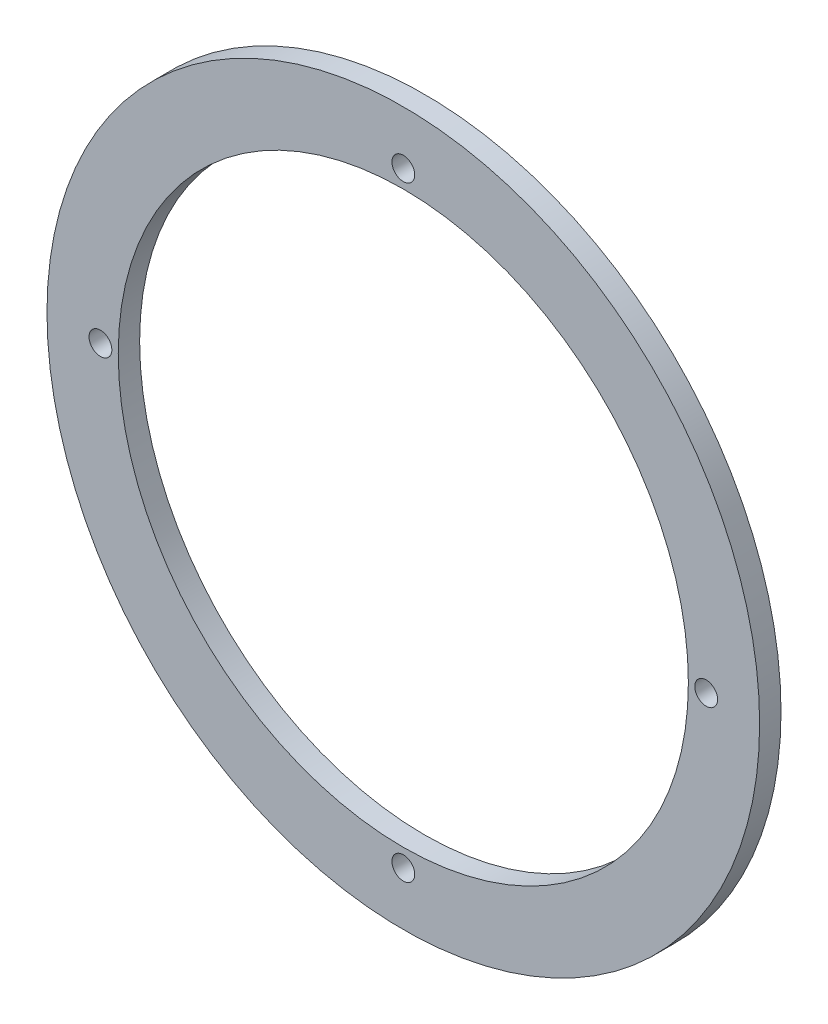
ISO-10303-21;
HEADER;
FILE_DESCRIPTION(('STEP AP214'),'2;1');
FILE_NAME('part.step','',(''),(''),'','','');
FILE_SCHEMA(('AUTOMOTIVE_DESIGN { 1 0 10303 214 1 1 1 1 }'));
ENDSEC;
DATA;
#1=APPLICATION_CONTEXT('core data for automotive mechanical design processes');
#2=APPLICATION_PROTOCOL_DEFINITION('international standard','automotive_design',2000,#1);
#3=PRODUCT_CONTEXT('',#1,'mechanical');
#4=PRODUCT('Part','Part','',(#3));
#5=PRODUCT_RELATED_PRODUCT_CATEGORY('part','',(#4));
#6=PRODUCT_DEFINITION_FORMATION('','',#4);
#7=PRODUCT_DEFINITION_CONTEXT('part definition',#1,'design');
#8=PRODUCT_DEFINITION('design','',#6,#7);
#9=PRODUCT_DEFINITION_SHAPE('','',#8);
#10=(LENGTH_UNIT() NAMED_UNIT(*) SI_UNIT(.MILLI.,.METRE.));
#11=(NAMED_UNIT(*) PLANE_ANGLE_UNIT() SI_UNIT($,.RADIAN.));
#12=(NAMED_UNIT(*) SI_UNIT($,.STERADIAN.) SOLID_ANGLE_UNIT());
#13=UNCERTAINTY_MEASURE_WITH_UNIT(LENGTH_MEASURE(1.E-05),#10,'distance_accuracy_value','');
#14=(GEOMETRIC_REPRESENTATION_CONTEXT(3) GLOBAL_UNCERTAINTY_ASSIGNED_CONTEXT((#13)) GLOBAL_UNIT_ASSIGNED_CONTEXT((#10,
#11,#12)) REPRESENTATION_CONTEXT('',''));
#15=CARTESIAN_POINT('',(0.,0.,0.));
#16=DIRECTION('',(0.,0.,1.));
#17=DIRECTION('',(1.,0.,0.));
#18=AXIS2_PLACEMENT_3D('',#15,#16,#17);
#19=CARTESIAN_POINT('',(0.,0.,3.));
#20=DIRECTION('',(0.,0.,1.));
#21=DIRECTION('',(1.,0.,0.));
#22=AXIS2_PLACEMENT_3D('',#19,#20,#21);
#23=PLANE('',#22);
#24=CARTESIAN_POINT('',(2.40023105489521E-12,-42.5,3.));
#25=DIRECTION('',(0.,0.,1.));
#26=DIRECTION('',(1.,0.,0.));
#27=AXIS2_PLACEMENT_3D('',#24,#25,#26);
#28=CIRCLE('',#27,1.60000000000258);
#29=CARTESIAN_POINT('',(1.60000000000498,-42.5,3.));
#30=VERTEX_POINT('',#29);
#31=EDGE_CURVE('E72',#30,#30,#28,.T.);
#32=ORIENTED_EDGE('',*,*,#31,.F.);
#33=EDGE_LOOP('',(#32));
#34=FACE_BOUND('',#33,.T.);
#35=CARTESIAN_POINT('',(0.,42.5,3.));
#36=DIRECTION('',(0.,0.,1.));
#37=DIRECTION('',(1.,0.,0.));
#38=AXIS2_PLACEMENT_3D('',#35,#36,#37);
#39=CIRCLE('',#38,1.6);
#40=CARTESIAN_POINT('',(1.6,42.5,3.));
#41=VERTEX_POINT('',#40);
#42=EDGE_CURVE('E56',#41,#41,#39,.T.);
#43=ORIENTED_EDGE('',*,*,#42,.F.);
#44=EDGE_LOOP('',(#43));
#45=FACE_BOUND('',#44,.T.);
#46=CARTESIAN_POINT('',(0.,0.,3.));
#47=DIRECTION('',(0.,0.,1.));
#48=DIRECTION('',(1.,0.,0.));
#49=AXIS2_PLACEMENT_3D('',#46,#47,#48);
#50=CIRCLE('',#49,50.);
#51=CARTESIAN_POINT('',(50.,0.,3.));
#52=VERTEX_POINT('',#51);
#53=EDGE_CURVE('E10',#52,#52,#50,.T.);
#54=ORIENTED_EDGE('',*,*,#53,.T.);
#55=EDGE_LOOP('',(#54));
#56=FACE_BOUND('',#55,.T.);
#57=CARTESIAN_POINT('',(0.,0.,3.));
#58=DIRECTION('',(0.,0.,1.));
#59=DIRECTION('',(1.,0.,0.));
#60=AXIS2_PLACEMENT_3D('',#57,#58,#59);
#61=CIRCLE('',#60,40.);
#62=CARTESIAN_POINT('',(40.,0.,3.));
#63=VERTEX_POINT('',#62);
#64=EDGE_CURVE('E50',#63,#63,#61,.T.);
#65=ORIENTED_EDGE('',*,*,#64,.F.);
#66=EDGE_LOOP('',(#65));
#67=FACE_BOUND('',#66,.T.);
#68=CARTESIAN_POINT('',(42.5000000000012,1.20011552744761E-12,3.));
#69=DIRECTION('',(0.,0.,1.));
#70=DIRECTION('',(1.,0.,0.));
#71=AXIS2_PLACEMENT_3D('',#68,#69,#70);
#72=CIRCLE('',#71,1.60000000000094);
#73=CARTESIAN_POINT('',(44.1000000000021,1.20011552744761E-12,3.));
#74=VERTEX_POINT('',#73);
#75=EDGE_CURVE('E64',#74,#74,#72,.T.);
#76=ORIENTED_EDGE('',*,*,#75,.F.);
#77=EDGE_LOOP('',(#76));
#78=FACE_BOUND('',#77,.T.);
#79=CARTESIAN_POINT('',(-42.4999999999988,-1.20532027634398E-12,3.));
#80=DIRECTION('',(0.,0.,1.));
#81=DIRECTION('',(1.,0.,0.));
#82=AXIS2_PLACEMENT_3D('',#79,#80,#81);
#83=CIRCLE('',#82,1.60000000000193);
#84=CARTESIAN_POINT('',(-40.8999999999969,-1.20532027634398E-12,3.));
#85=VERTEX_POINT('',#84);
#86=EDGE_CURVE('E80',#85,#85,#83,.T.);
#87=ORIENTED_EDGE('',*,*,#86,.F.);
#88=EDGE_LOOP('',(#87));
#89=FACE_BOUND('',#88,.T.);
#90=ADVANCED_FACE('F37',(#34,#45,#56,#67,#78,#89),#23,.T.);
#91=CARTESIAN_POINT('',(0.,0.,0.));
#92=DIRECTION('',(0.,0.,1.));
#93=DIRECTION('',(1.,0.,0.));
#94=AXIS2_PLACEMENT_3D('',#91,#92,#93);
#95=PLANE('',#94);
#96=CARTESIAN_POINT('',(0.,0.,0.));
#97=DIRECTION('',(0.,0.,1.));
#98=DIRECTION('',(1.,0.,0.));
#99=AXIS2_PLACEMENT_3D('',#96,#97,#98);
#100=CIRCLE('',#99,50.);
#101=CARTESIAN_POINT('',(50.,0.,0.));
#102=VERTEX_POINT('',#101);
#103=EDGE_CURVE('E41',#102,#102,#100,.T.);
#104=ORIENTED_EDGE('',*,*,#103,.F.);
#105=EDGE_LOOP('',(#104));
#106=FACE_BOUND('',#105,.T.);
#107=CARTESIAN_POINT('',(0.,0.,0.));
#108=DIRECTION('',(0.,0.,1.));
#109=DIRECTION('',(1.,0.,0.));
#110=AXIS2_PLACEMENT_3D('',#107,#108,#109);
#111=CIRCLE('',#110,40.);
#112=CARTESIAN_POINT('',(40.,0.,0.));
#113=VERTEX_POINT('',#112);
#114=EDGE_CURVE('E52',#113,#113,#111,.T.);
#115=ORIENTED_EDGE('',*,*,#114,.T.);
#116=EDGE_LOOP('',(#115));
#117=FACE_BOUND('',#116,.T.);
#118=CARTESIAN_POINT('',(0.,42.5,0.));
#119=DIRECTION('',(0.,0.,1.));
#120=DIRECTION('',(1.,0.,0.));
#121=AXIS2_PLACEMENT_3D('',#118,#119,#120);
#122=CIRCLE('',#121,1.6);
#123=CARTESIAN_POINT('',(1.6,42.5,0.));
#124=VERTEX_POINT('',#123);
#125=EDGE_CURVE('E60',#124,#124,#122,.T.);
#126=ORIENTED_EDGE('',*,*,#125,.T.);
#127=EDGE_LOOP('',(#126));
#128=FACE_BOUND('',#127,.T.);
#129=CARTESIAN_POINT('',(42.5000000000012,1.20011552744761E-12,0.));
#130=DIRECTION('',(0.,0.,1.));
#131=DIRECTION('',(1.,0.,0.));
#132=AXIS2_PLACEMENT_3D('',#129,#130,#131);
#133=CIRCLE('',#132,1.60000000000094);
#134=CARTESIAN_POINT('',(44.1000000000021,1.20011552744761E-12,0.));
#135=VERTEX_POINT('',#134);
#136=EDGE_CURVE('E68',#135,#135,#133,.T.);
#137=ORIENTED_EDGE('',*,*,#136,.T.);
#138=EDGE_LOOP('',(#137));
#139=FACE_BOUND('',#138,.T.);
#140=CARTESIAN_POINT('',(2.40023105489521E-12,-42.5,0.));
#141=DIRECTION('',(0.,0.,1.));
#142=DIRECTION('',(1.,0.,0.));
#143=AXIS2_PLACEMENT_3D('',#140,#141,#142);
#144=CIRCLE('',#143,1.60000000000258);
#145=CARTESIAN_POINT('',(1.60000000000498,-42.5,0.));
#146=VERTEX_POINT('',#145);
#147=EDGE_CURVE('E76',#146,#146,#144,.T.);
#148=ORIENTED_EDGE('',*,*,#147,.T.);
#149=EDGE_LOOP('',(#148));
#150=FACE_BOUND('',#149,.T.);
#151=CARTESIAN_POINT('',(-42.4999999999988,-1.20532027634398E-12,0.));
#152=DIRECTION('',(0.,0.,1.));
#153=DIRECTION('',(1.,0.,0.));
#154=AXIS2_PLACEMENT_3D('',#151,#152,#153);
#155=CIRCLE('',#154,1.60000000000193);
#156=CARTESIAN_POINT('',(-40.8999999999969,-1.20532027634398E-12,0.));
#157=VERTEX_POINT('',#156);
#158=EDGE_CURVE('E84',#157,#157,#155,.T.);
#159=ORIENTED_EDGE('',*,*,#158,.T.);
#160=EDGE_LOOP('',(#159));
#161=FACE_BOUND('',#160,.T.);
#162=ADVANCED_FACE('F96',(#106,#117,#128,#139,#150,#161),#95,.F.);
#163=CARTESIAN_POINT('',(0.,0.,3.));
#164=DIRECTION('',(0.,0.,-1.));
#165=DIRECTION('',(-1.,0.,0.));
#166=AXIS2_PLACEMENT_3D('',#163,#164,#165);
#167=CYLINDRICAL_SURFACE('',#166,50.);
#168=ORIENTED_EDGE('',*,*,#53,.F.);
#169=EDGE_LOOP('',(#168));
#170=FACE_BOUND('',#169,.T.);
#171=ORIENTED_EDGE('',*,*,#103,.T.);
#172=EDGE_LOOP('',(#171));
#173=FACE_BOUND('',#172,.T.);
#174=ADVANCED_FACE('F39',(#170,#173),#167,.T.);
#175=CARTESIAN_POINT('',(0.,0.,3.));
#176=DIRECTION('',(0.,0.,-1.));
#177=DIRECTION('',(-1.,0.,0.));
#178=AXIS2_PLACEMENT_3D('',#175,#176,#177);
#179=CYLINDRICAL_SURFACE('',#178,40.);
#180=ORIENTED_EDGE('',*,*,#64,.T.);
#181=EDGE_LOOP('',(#180));
#182=FACE_BOUND('',#181,.T.);
#183=ORIENTED_EDGE('',*,*,#114,.F.);
#184=EDGE_LOOP('',(#183));
#185=FACE_BOUND('',#184,.T.);
#186=ADVANCED_FACE('F106',(#182,#185),#179,.F.);
#187=CARTESIAN_POINT('',(0.,42.5,3.));
#188=DIRECTION('',(0.,0.,-1.));
#189=DIRECTION('',(-1.,0.,0.));
#190=AXIS2_PLACEMENT_3D('',#187,#188,#189);
#191=CYLINDRICAL_SURFACE('',#190,1.6);
#192=ORIENTED_EDGE('',*,*,#42,.T.);
#193=EDGE_LOOP('',(#192));
#194=FACE_BOUND('',#193,.T.);
#195=ORIENTED_EDGE('',*,*,#125,.F.);
#196=EDGE_LOOP('',(#195));
#197=FACE_BOUND('',#196,.T.);
#198=ADVANCED_FACE('F109',(#194,#197),#191,.F.);
#199=CARTESIAN_POINT('',(42.5000000000012,1.20011552744761E-12,3.));
#200=DIRECTION('',(0.,0.,-1.));
#201=DIRECTION('',(-1.,0.,0.));
#202=AXIS2_PLACEMENT_3D('',#199,#200,#201);
#203=CYLINDRICAL_SURFACE('',#202,1.60000000000094);
#204=ORIENTED_EDGE('',*,*,#75,.T.);
#205=EDGE_LOOP('',(#204));
#206=FACE_BOUND('',#205,.T.);
#207=ORIENTED_EDGE('',*,*,#136,.F.);
#208=EDGE_LOOP('',(#207));
#209=FACE_BOUND('',#208,.T.);
#210=ADVANCED_FACE('F113',(#206,#209),#203,.F.);
#211=CARTESIAN_POINT('',(2.40023105489521E-12,-42.5,3.));
#212=DIRECTION('',(0.,0.,-1.));
#213=DIRECTION('',(-1.,0.,0.));
#214=AXIS2_PLACEMENT_3D('',#211,#212,#213);
#215=CYLINDRICAL_SURFACE('',#214,1.60000000000258);
#216=ORIENTED_EDGE('',*,*,#31,.T.);
#217=EDGE_LOOP('',(#216));
#218=FACE_BOUND('',#217,.T.);
#219=ORIENTED_EDGE('',*,*,#147,.F.);
#220=EDGE_LOOP('',(#219));
#221=FACE_BOUND('',#220,.T.);
#222=ADVANCED_FACE('F117',(#218,#221),#215,.F.);
#223=CARTESIAN_POINT('',(-42.4999999999988,-1.20532027634398E-12,3.));
#224=DIRECTION('',(0.,0.,-1.));
#225=DIRECTION('',(-1.,0.,0.));
#226=AXIS2_PLACEMENT_3D('',#223,#224,#225);
#227=CYLINDRICAL_SURFACE('',#226,1.60000000000193);
#228=ORIENTED_EDGE('',*,*,#86,.T.);
#229=EDGE_LOOP('',(#228));
#230=FACE_BOUND('',#229,.T.);
#231=ORIENTED_EDGE('',*,*,#158,.F.);
#232=EDGE_LOOP('',(#231));
#233=FACE_BOUND('',#232,.T.);
#234=ADVANCED_FACE('F92',(#230,#233),#227,.F.);
#235=CLOSED_SHELL('',(#90,#162,#174,#186,#198,#210,#222,#234));
#236=MANIFOLD_SOLID_BREP('B2',#235);
#237=ADVANCED_BREP_SHAPE_REPRESENTATION('',(#18,#236),#14);
#238=SHAPE_DEFINITION_REPRESENTATION(#9,#237);
ENDSEC;
END-ISO-10303-21;
